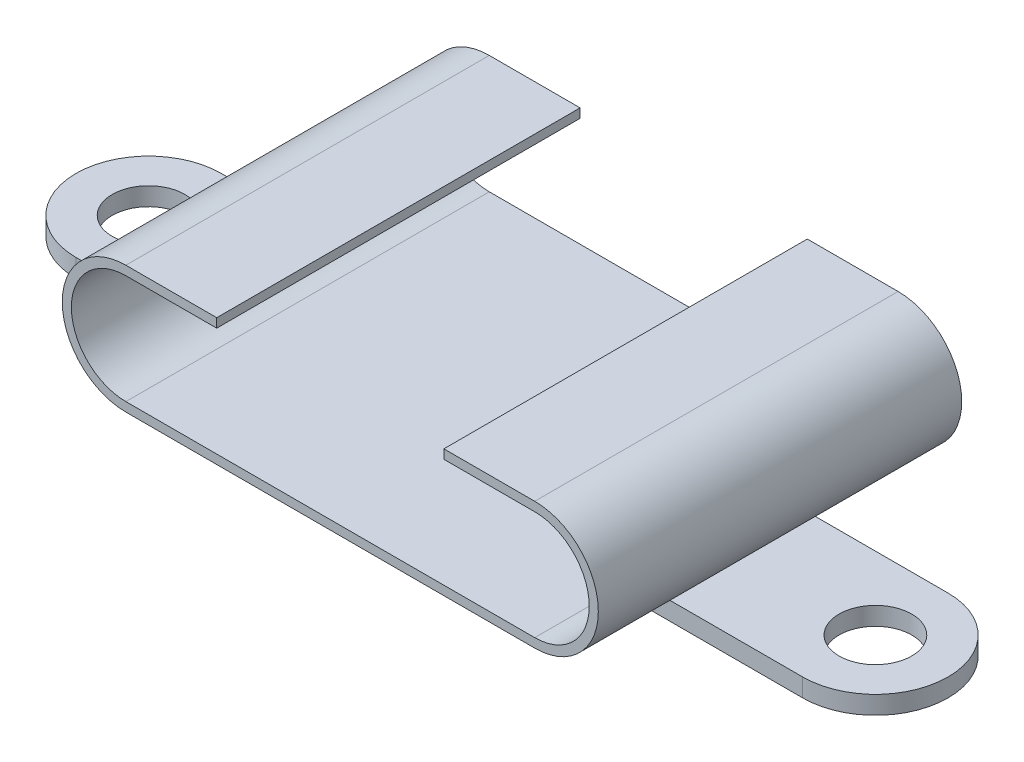
ISO-10303-21;
HEADER;
FILE_DESCRIPTION(('STEP AP214'),'2;1');
FILE_NAME('part.step','',(''),(''),'','','');
FILE_SCHEMA(('AUTOMOTIVE_DESIGN { 1 0 10303 214 1 1 1 1 }'));
ENDSEC;
DATA;
#1=APPLICATION_CONTEXT('core data for automotive mechanical design processes');
#2=APPLICATION_PROTOCOL_DEFINITION('international standard','automotive_design',2000,#1);
#3=PRODUCT_CONTEXT('',#1,'mechanical');
#4=PRODUCT('Part','Part','',(#3));
#5=PRODUCT_RELATED_PRODUCT_CATEGORY('part','',(#4));
#6=PRODUCT_DEFINITION_FORMATION('','',#4);
#7=PRODUCT_DEFINITION_CONTEXT('part definition',#1,'design');
#8=PRODUCT_DEFINITION('design','',#6,#7);
#9=PRODUCT_DEFINITION_SHAPE('','',#8);
#10=(LENGTH_UNIT() NAMED_UNIT(*) SI_UNIT(.MILLI.,.METRE.));
#11=(NAMED_UNIT(*) PLANE_ANGLE_UNIT() SI_UNIT($,.RADIAN.));
#12=(NAMED_UNIT(*) SI_UNIT($,.STERADIAN.) SOLID_ANGLE_UNIT());
#13=UNCERTAINTY_MEASURE_WITH_UNIT(LENGTH_MEASURE(1.E-05),#10,'distance_accuracy_value','');
#14=(GEOMETRIC_REPRESENTATION_CONTEXT(3) GLOBAL_UNCERTAINTY_ASSIGNED_CONTEXT((#13)) GLOBAL_UNIT_ASSIGNED_CONTEXT((#10,
#11,#12)) REPRESENTATION_CONTEXT('',''));
#15=CARTESIAN_POINT('',(0.,0.,0.));
#16=DIRECTION('',(0.,0.,1.));
#17=DIRECTION('',(1.,0.,0.));
#18=AXIS2_PLACEMENT_3D('',#15,#16,#17);
#19=CARTESIAN_POINT('',(0.,-7.,40.));
#20=DIRECTION('',(0.,1.,0.));
#21=DIRECTION('',(0.,0.,1.));
#22=AXIS2_PLACEMENT_3D('',#19,#20,#21);
#23=PLANE('',#22);
#24=DIRECTION('',(-1.,0.,0.));
#25=VECTOR('',#24,1.);
#26=CARTESIAN_POINT('',(62.5,-7.,28.));
#27=LINE('',#26,#25);
#28=CARTESIAN_POINT('',(45.,-7.,28.));
#29=VERTEX_POINT('',#28);
#30=CARTESIAN_POINT('',(0.,-7.,28.));
#31=VERTEX_POINT('',#30);
#32=EDGE_CURVE('E304',#29,#31,#27,.T.);
#33=ORIENTED_EDGE('',*,*,#32,.F.);
#34=DIRECTION('',(0.,0.,-1.));
#35=VECTOR('',#34,1.);
#36=CARTESIAN_POINT('',(45.,-7.,40.));
#37=LINE('',#36,#35);
#38=CARTESIAN_POINT('',(45.,-7.,40.));
#39=VERTEX_POINT('',#38);
#40=EDGE_CURVE('E273',#39,#29,#37,.T.);
#41=ORIENTED_EDGE('',*,*,#40,.F.);
#42=DIRECTION('',(1.,0.,0.));
#43=VECTOR('',#42,1.);
#44=CARTESIAN_POINT('',(0.,-7.,40.));
#45=LINE('',#44,#43);
#46=CARTESIAN_POINT('',(0.,-7.,40.));
#47=VERTEX_POINT('',#46);
#48=EDGE_CURVE('E248',#47,#39,#45,.T.);
#49=ORIENTED_EDGE('',*,*,#48,.F.);
#50=DIRECTION('',(0.,0.,-1.));
#51=VECTOR('',#50,1.);
#52=CARTESIAN_POINT('',(0.,-7.,40.));
#53=LINE('',#52,#51);
#54=EDGE_CURVE('E11',#47,#31,#53,.T.);
#55=ORIENTED_EDGE('',*,*,#54,.T.);
#56=EDGE_LOOP('',(#33,#41,#49,#55));
#57=FACE_BOUND('',#56,.T.);
#58=ADVANCED_FACE('F33',(#57),#23,.F.);
#59=DIRECTION('',(1.,0.,0.));
#60=VECTOR('',#59,1.);
#61=CARTESIAN_POINT('',(62.5,-7.,12.));
#62=LINE('',#61,#60);
#63=CARTESIAN_POINT('',(0.,-7.,12.));
#64=VERTEX_POINT('',#63);
#65=CARTESIAN_POINT('',(45.,-7.,12.));
#66=VERTEX_POINT('',#65);
#67=EDGE_CURVE('E48',#64,#66,#62,.T.);
#68=ORIENTED_EDGE('',*,*,#67,.F.);
#69=CARTESIAN_POINT('',(0.,-7.,0.));
#70=VERTEX_POINT('',#69);
#71=EDGE_CURVE('E41',#64,#70,#53,.T.);
#72=ORIENTED_EDGE('',*,*,#71,.T.);
#73=DIRECTION('',(1.,0.,0.));
#74=VECTOR('',#73,1.);
#75=CARTESIAN_POINT('',(0.,-7.,0.));
#76=LINE('',#75,#74);
#77=CARTESIAN_POINT('',(45.,-7.,0.));
#78=VERTEX_POINT('',#77);
#79=EDGE_CURVE('E260',#70,#78,#76,.T.);
#80=ORIENTED_EDGE('',*,*,#79,.T.);
#81=EDGE_CURVE('E272',#66,#78,#37,.T.);
#82=ORIENTED_EDGE('',*,*,#81,.F.);
#83=EDGE_LOOP('',(#68,#72,#80,#82));
#84=FACE_BOUND('',#83,.T.);
#85=ADVANCED_FACE('F286',(#84),#23,.F.);
#86=CARTESIAN_POINT('',(0.,7.,40.));
#87=DIRECTION('',(0.,-1.,0.));
#88=DIRECTION('',(0.,0.,-1.));
#89=AXIS2_PLACEMENT_3D('',#86,#87,#88);
#90=PLANE('',#89);
#91=DIRECTION('',(-1.,0.,0.));
#92=VECTOR('',#91,1.);
#93=CARTESIAN_POINT('',(0.,7.,0.));
#94=LINE('',#93,#92);
#95=CARTESIAN_POINT('',(45.,7.,0.));
#96=VERTEX_POINT('',#95);
#97=CARTESIAN_POINT('',(35.0018715987824,7.,0.));
#98=VERTEX_POINT('',#97);
#99=EDGE_CURVE('E249',#96,#98,#94,.T.);
#100=ORIENTED_EDGE('',*,*,#99,.T.);
#101=DIRECTION('',(0.,0.,-1.));
#102=VECTOR('',#101,1.);
#103=CARTESIAN_POINT('',(35.0018715987824,7.,0.));
#104=LINE('',#103,#102);
#105=CARTESIAN_POINT('',(35.0018715987824,7.,40.));
#106=VERTEX_POINT('',#105);
#107=EDGE_CURVE('E198',#106,#98,#104,.T.);
#108=ORIENTED_EDGE('',*,*,#107,.F.);
#109=DIRECTION('',(-1.,0.,0.));
#110=VECTOR('',#109,1.);
#111=CARTESIAN_POINT('',(0.,7.,40.));
#112=LINE('',#111,#110);
#113=CARTESIAN_POINT('',(45.,7.,40.));
#114=VERTEX_POINT('',#113);
#115=EDGE_CURVE('E254',#114,#106,#112,.T.);
#116=ORIENTED_EDGE('',*,*,#115,.F.);
#117=DIRECTION('',(0.,0.,-1.));
#118=VECTOR('',#117,1.);
#119=CARTESIAN_POINT('',(45.,7.,40.));
#120=LINE('',#119,#118);
#121=EDGE_CURVE('E270',#114,#96,#120,.T.);
#122=ORIENTED_EDGE('',*,*,#121,.T.);
#123=EDGE_LOOP('',(#100,#108,#116,#122));
#124=FACE_BOUND('',#123,.T.);
#125=ADVANCED_FACE('F294',(#124),#90,.F.);
#126=CARTESIAN_POINT('',(45.,6.,0.));
#127=DIRECTION('',(0.,1.,0.));
#128=DIRECTION('',(0.,0.,1.));
#129=AXIS2_PLACEMENT_3D('',#126,#127,#128);
#130=PLANE('',#129);
#131=DIRECTION('',(-1.,0.,0.));
#132=VECTOR('',#131,1.);
#133=CARTESIAN_POINT('',(45.,6.,40.));
#134=LINE('',#133,#132);
#135=CARTESIAN_POINT('',(45.,6.,40.));
#136=VERTEX_POINT('',#135);
#137=CARTESIAN_POINT('',(35.0018715987824,6.,40.));
#138=VERTEX_POINT('',#137);
#139=EDGE_CURVE('E214',#136,#138,#134,.T.);
#140=ORIENTED_EDGE('',*,*,#139,.T.);
#141=DIRECTION('',(0.,0.,1.));
#142=VECTOR('',#141,1.);
#143=CARTESIAN_POINT('',(35.0018715987824,6.,0.));
#144=LINE('',#143,#142);
#145=CARTESIAN_POINT('',(35.0018715987824,6.,0.));
#146=VERTEX_POINT('',#145);
#147=EDGE_CURVE('E194',#146,#138,#144,.T.);
#148=ORIENTED_EDGE('',*,*,#147,.F.);
#149=DIRECTION('',(-1.,0.,0.));
#150=VECTOR('',#149,1.);
#151=CARTESIAN_POINT('',(45.,6.,0.));
#152=LINE('',#151,#150);
#153=CARTESIAN_POINT('',(45.,6.,0.));
#154=VERTEX_POINT('',#153);
#155=EDGE_CURVE('E221',#154,#146,#152,.T.);
#156=ORIENTED_EDGE('',*,*,#155,.F.);
#157=DIRECTION('',(0.,0.,1.));
#158=VECTOR('',#157,1.);
#159=CARTESIAN_POINT('',(45.,6.,0.));
#160=LINE('',#159,#158);
#161=EDGE_CURVE('E239',#154,#136,#160,.T.);
#162=ORIENTED_EDGE('',*,*,#161,.T.);
#163=EDGE_LOOP('',(#140,#148,#156,#162));
#164=FACE_BOUND('',#163,.T.);
#165=ADVANCED_FACE('F356',(#164),#130,.F.);
#166=CARTESIAN_POINT('',(0.,0.,40.));
#167=DIRECTION('',(0.,0.,-1.));
#168=DIRECTION('',(-1.,0.,0.));
#169=AXIS2_PLACEMENT_3D('',#166,#167,#168);
#170=CYLINDRICAL_SURFACE('',#169,7.);
#171=CARTESIAN_POINT('',(0.,0.,0.));
#172=DIRECTION('',(0.,0.,1.));
#173=DIRECTION('',(1.,0.,0.));
#174=AXIS2_PLACEMENT_3D('',#171,#172,#173);
#175=CIRCLE('',#174,7.);
#176=CARTESIAN_POINT('',(0.,7.,0.));
#177=VERTEX_POINT('',#176);
#178=EDGE_CURVE('E238',#177,#70,#175,.T.);
#179=ORIENTED_EDGE('',*,*,#178,.T.);
#180=ORIENTED_EDGE('',*,*,#71,.F.);
#181=DIRECTION('',(0.,0.,-1.));
#182=VECTOR('',#181,1.);
#183=CARTESIAN_POINT('',(0.,-7.,40.));
#184=LINE('',#183,#182);
#185=EDGE_CURVE('E186',#31,#64,#184,.T.);
#186=ORIENTED_EDGE('',*,*,#185,.F.);
#187=ORIENTED_EDGE('',*,*,#54,.F.);
#188=CARTESIAN_POINT('',(0.,0.,40.));
#189=DIRECTION('',(0.,0.,1.));
#190=DIRECTION('',(1.,0.,0.));
#191=AXIS2_PLACEMENT_3D('',#188,#189,#190);
#192=CIRCLE('',#191,7.);
#193=CARTESIAN_POINT('',(0.,7.,40.));
#194=VERTEX_POINT('',#193);
#195=EDGE_CURVE('E245',#194,#47,#192,.T.);
#196=ORIENTED_EDGE('',*,*,#195,.F.);
#197=DIRECTION('',(0.,0.,-1.));
#198=VECTOR('',#197,1.);
#199=CARTESIAN_POINT('',(0.,7.,40.));
#200=LINE('',#199,#198);
#201=EDGE_CURVE('E257',#194,#177,#200,.T.);
#202=ORIENTED_EDGE('',*,*,#201,.T.);
#203=EDGE_LOOP('',(#179,#180,#186,#187,#196,#202));
#204=FACE_BOUND('',#203,.T.);
#205=ADVANCED_FACE('F35',(#204),#170,.T.);
#206=CARTESIAN_POINT('',(45.,0.,40.));
#207=DIRECTION('',(0.,0.,-1.));
#208=DIRECTION('',(-1.,0.,0.));
#209=AXIS2_PLACEMENT_3D('',#206,#207,#208);
#210=CYLINDRICAL_SURFACE('',#209,7.);
#211=CARTESIAN_POINT('',(45.,0.,0.));
#212=DIRECTION('',(0.,0.,1.));
#213=DIRECTION('',(1.,0.,0.));
#214=AXIS2_PLACEMENT_3D('',#211,#212,#213);
#215=CIRCLE('',#214,7.);
#216=EDGE_CURVE('E263',#78,#96,#215,.T.);
#217=ORIENTED_EDGE('',*,*,#216,.T.);
#218=ORIENTED_EDGE('',*,*,#121,.F.);
#219=CARTESIAN_POINT('',(45.,0.,40.));
#220=DIRECTION('',(0.,0.,1.));
#221=DIRECTION('',(1.,0.,0.));
#222=AXIS2_PLACEMENT_3D('',#219,#220,#221);
#223=CIRCLE('',#222,7.);
#224=EDGE_CURVE('E251',#39,#114,#223,.T.);
#225=ORIENTED_EDGE('',*,*,#224,.F.);
#226=ORIENTED_EDGE('',*,*,#40,.T.);
#227=EDGE_CURVE('E275',#29,#66,#37,.T.);
#228=ORIENTED_EDGE('',*,*,#227,.T.);
#229=ORIENTED_EDGE('',*,*,#81,.T.);
#230=EDGE_LOOP('',(#217,#218,#225,#226,#228,#229));
#231=FACE_BOUND('',#230,.T.);
#232=ADVANCED_FACE('F281',(#231),#210,.T.);
#233=CARTESIAN_POINT('',(9.99812840121763,7.,40.));
#234=VERTEX_POINT('',#233);
#235=EDGE_CURVE('E253',#234,#194,#112,.T.);
#236=ORIENTED_EDGE('',*,*,#235,.F.);
#237=DIRECTION('',(0.,0.,1.));
#238=VECTOR('',#237,1.);
#239=CARTESIAN_POINT('',(9.99812840121763,7.,0.));
#240=LINE('',#239,#238);
#241=CARTESIAN_POINT('',(9.99812840121763,7.,0.));
#242=VERTEX_POINT('',#241);
#243=EDGE_CURVE('E188',#242,#234,#240,.T.);
#244=ORIENTED_EDGE('',*,*,#243,.F.);
#245=EDGE_CURVE('E265',#242,#177,#94,.T.);
#246=ORIENTED_EDGE('',*,*,#245,.T.);
#247=ORIENTED_EDGE('',*,*,#201,.F.);
#248=EDGE_LOOP('',(#236,#244,#246,#247));
#249=FACE_BOUND('',#248,.T.);
#250=ADVANCED_FACE('F333',(#249),#90,.F.);
#251=CARTESIAN_POINT('',(0.,0.,40.));
#252=DIRECTION('',(0.,0.,1.));
#253=DIRECTION('',(1.,0.,0.));
#254=AXIS2_PLACEMENT_3D('',#251,#252,#253);
#255=PLANE('',#254);
#256=DIRECTION('',(0.,1.,0.));
#257=VECTOR('',#256,1.);
#258=CARTESIAN_POINT('',(35.0018715987824,-41.1718896578223,40.));
#259=LINE('',#258,#257);
#260=EDGE_CURVE('E202',#138,#106,#259,.T.);
#261=ORIENTED_EDGE('',*,*,#260,.F.);
#262=ORIENTED_EDGE('',*,*,#139,.F.);
#263=CARTESIAN_POINT('',(45.,0.,40.));
#264=DIRECTION('',(0.,0.,1.));
#265=DIRECTION('',(1.,0.,0.));
#266=AXIS2_PLACEMENT_3D('',#263,#264,#265);
#267=CIRCLE('',#266,6.);
#268=CARTESIAN_POINT('',(45.,-6.,40.));
#269=VERTEX_POINT('',#268);
#270=EDGE_CURVE('E229',#269,#136,#267,.T.);
#271=ORIENTED_EDGE('',*,*,#270,.F.);
#272=DIRECTION('',(1.,0.,0.));
#273=VECTOR('',#272,1.);
#274=CARTESIAN_POINT('',(0.,-6.,40.));
#275=LINE('',#274,#273);
#276=CARTESIAN_POINT('',(0.,-6.,40.));
#277=VERTEX_POINT('',#276);
#278=EDGE_CURVE('E226',#277,#269,#275,.T.);
#279=ORIENTED_EDGE('',*,*,#278,.F.);
#280=CARTESIAN_POINT('',(0.,0.,40.));
#281=DIRECTION('',(0.,0.,1.));
#282=DIRECTION('',(1.,0.,0.));
#283=AXIS2_PLACEMENT_3D('',#280,#281,#282);
#284=CIRCLE('',#283,6.);
#285=CARTESIAN_POINT('',(0.,6.,40.));
#286=VERTEX_POINT('',#285);
#287=EDGE_CURVE('E209',#286,#277,#284,.T.);
#288=ORIENTED_EDGE('',*,*,#287,.F.);
#289=CARTESIAN_POINT('',(9.99812840121765,6.,40.));
#290=VERTEX_POINT('',#289);
#291=EDGE_CURVE('E232',#290,#286,#134,.T.);
#292=ORIENTED_EDGE('',*,*,#291,.F.);
#293=DIRECTION('',(0.,1.,0.));
#294=VECTOR('',#293,1.);
#295=CARTESIAN_POINT('',(9.99812840121763,-41.1718896578223,40.));
#296=LINE('',#295,#294);
#297=EDGE_CURVE('E204',#290,#234,#296,.T.);
#298=ORIENTED_EDGE('',*,*,#297,.T.);
#299=ORIENTED_EDGE('',*,*,#235,.T.);
#300=ORIENTED_EDGE('',*,*,#195,.T.);
#301=ORIENTED_EDGE('',*,*,#48,.T.);
#302=ORIENTED_EDGE('',*,*,#224,.T.);
#303=ORIENTED_EDGE('',*,*,#115,.T.);
#304=EDGE_LOOP('',(#261,#262,#271,#279,#288,#292,#298,#299,#300,#301,#302,#303));
#305=FACE_BOUND('',#304,.T.);
#306=ADVANCED_FACE('F298',(#305),#255,.T.);
#307=CARTESIAN_POINT('',(0.,0.,0.));
#308=DIRECTION('',(0.,0.,1.));
#309=DIRECTION('',(1.,0.,0.));
#310=AXIS2_PLACEMENT_3D('',#307,#308,#309);
#311=PLANE('',#310);
#312=ORIENTED_EDGE('',*,*,#155,.T.);
#313=DIRECTION('',(0.,1.,0.));
#314=VECTOR('',#313,1.);
#315=CARTESIAN_POINT('',(35.0018715987824,-41.1718896578223,0.));
#316=LINE('',#315,#314);
#317=EDGE_CURVE('E56',#146,#98,#316,.T.);
#318=ORIENTED_EDGE('',*,*,#317,.T.);
#319=ORIENTED_EDGE('',*,*,#99,.F.);
#320=ORIENTED_EDGE('',*,*,#216,.F.);
#321=ORIENTED_EDGE('',*,*,#79,.F.);
#322=ORIENTED_EDGE('',*,*,#178,.F.);
#323=ORIENTED_EDGE('',*,*,#245,.F.);
#324=DIRECTION('',(0.,1.,0.));
#325=VECTOR('',#324,1.);
#326=CARTESIAN_POINT('',(9.99812840121763,-41.1718896578223,0.));
#327=LINE('',#326,#325);
#328=CARTESIAN_POINT('',(9.99812840121763,6.,0.));
#329=VERTEX_POINT('',#328);
#330=EDGE_CURVE('E200',#329,#242,#327,.T.);
#331=ORIENTED_EDGE('',*,*,#330,.F.);
#332=CARTESIAN_POINT('',(0.,6.,0.));
#333=VERTEX_POINT('',#332);
#334=EDGE_CURVE('E220',#329,#333,#152,.T.);
#335=ORIENTED_EDGE('',*,*,#334,.T.);
#336=CARTESIAN_POINT('',(0.,0.,0.));
#337=DIRECTION('',(0.,0.,1.));
#338=DIRECTION('',(1.,0.,0.));
#339=AXIS2_PLACEMENT_3D('',#336,#337,#338);
#340=CIRCLE('',#339,6.);
#341=CARTESIAN_POINT('',(0.,-6.,0.));
#342=VERTEX_POINT('',#341);
#343=EDGE_CURVE('E210',#333,#342,#340,.T.);
#344=ORIENTED_EDGE('',*,*,#343,.T.);
#345=DIRECTION('',(1.,0.,0.));
#346=VECTOR('',#345,1.);
#347=CARTESIAN_POINT('',(0.,-6.,0.));
#348=LINE('',#347,#346);
#349=CARTESIAN_POINT('',(45.,-6.,0.));
#350=VERTEX_POINT('',#349);
#351=EDGE_CURVE('E213',#342,#350,#348,.T.);
#352=ORIENTED_EDGE('',*,*,#351,.T.);
#353=CARTESIAN_POINT('',(45.,0.,0.));
#354=DIRECTION('',(0.,0.,1.));
#355=DIRECTION('',(1.,0.,0.));
#356=AXIS2_PLACEMENT_3D('',#353,#354,#355);
#357=CIRCLE('',#356,6.);
#358=EDGE_CURVE('E217',#350,#154,#357,.T.);
#359=ORIENTED_EDGE('',*,*,#358,.T.);
#360=EDGE_LOOP('',(#312,#318,#319,#320,#321,#322,#323,#331,#335,#344,#352,#359));
#361=FACE_BOUND('',#360,.T.);
#362=ADVANCED_FACE('F291',(#361),#311,.F.);
#363=CARTESIAN_POINT('',(0.,0.,0.));
#364=DIRECTION('',(0.,0.,1.));
#365=DIRECTION('',(1.,0.,0.));
#366=AXIS2_PLACEMENT_3D('',#363,#364,#365);
#367=CYLINDRICAL_SURFACE('',#366,6.);
#368=ORIENTED_EDGE('',*,*,#287,.T.);
#369=DIRECTION('',(0.,0.,1.));
#370=VECTOR('',#369,1.);
#371=CARTESIAN_POINT('',(0.,-6.,0.));
#372=LINE('',#371,#370);
#373=EDGE_CURVE('E224',#342,#277,#372,.T.);
#374=ORIENTED_EDGE('',*,*,#373,.F.);
#375=ORIENTED_EDGE('',*,*,#343,.F.);
#376=DIRECTION('',(0.,0.,1.));
#377=VECTOR('',#376,1.);
#378=CARTESIAN_POINT('',(0.,6.,0.));
#379=LINE('',#378,#377);
#380=EDGE_CURVE('E235',#333,#286,#379,.T.);
#381=ORIENTED_EDGE('',*,*,#380,.T.);
#382=EDGE_LOOP('',(#368,#374,#375,#381));
#383=FACE_BOUND('',#382,.T.);
#384=ADVANCED_FACE('F345',(#383),#367,.F.);
#385=ORIENTED_EDGE('',*,*,#334,.F.);
#386=DIRECTION('',(0.,0.,-1.));
#387=VECTOR('',#386,1.);
#388=CARTESIAN_POINT('',(9.99812840121763,6.,0.));
#389=LINE('',#388,#387);
#390=EDGE_CURVE('E196',#290,#329,#389,.T.);
#391=ORIENTED_EDGE('',*,*,#390,.F.);
#392=ORIENTED_EDGE('',*,*,#291,.T.);
#393=ORIENTED_EDGE('',*,*,#380,.F.);
#394=EDGE_LOOP('',(#385,#391,#392,#393));
#395=FACE_BOUND('',#394,.T.);
#396=ADVANCED_FACE('F342',(#395),#130,.F.);
#397=CARTESIAN_POINT('',(45.,0.,0.));
#398=DIRECTION('',(0.,0.,1.));
#399=DIRECTION('',(1.,0.,0.));
#400=AXIS2_PLACEMENT_3D('',#397,#398,#399);
#401=CYLINDRICAL_SURFACE('',#400,6.);
#402=ORIENTED_EDGE('',*,*,#270,.T.);
#403=ORIENTED_EDGE('',*,*,#161,.F.);
#404=ORIENTED_EDGE('',*,*,#358,.F.);
#405=DIRECTION('',(0.,0.,1.));
#406=VECTOR('',#405,1.);
#407=CARTESIAN_POINT('',(45.,-6.,0.));
#408=LINE('',#407,#406);
#409=EDGE_CURVE('E241',#350,#269,#408,.T.);
#410=ORIENTED_EDGE('',*,*,#409,.T.);
#411=EDGE_LOOP('',(#402,#403,#404,#410));
#412=FACE_BOUND('',#411,.T.);
#413=ADVANCED_FACE('F352',(#412),#401,.F.);
#414=CARTESIAN_POINT('',(0.,-6.,0.));
#415=DIRECTION('',(0.,-1.,0.));
#416=DIRECTION('',(0.,0.,-1.));
#417=AXIS2_PLACEMENT_3D('',#414,#415,#416);
#418=PLANE('',#417);
#419=ORIENTED_EDGE('',*,*,#278,.T.);
#420=ORIENTED_EDGE('',*,*,#409,.F.);
#421=ORIENTED_EDGE('',*,*,#351,.F.);
#422=ORIENTED_EDGE('',*,*,#373,.T.);
#423=EDGE_LOOP('',(#419,#420,#421,#422));
#424=FACE_BOUND('',#423,.T.);
#425=ADVANCED_FACE('F349',(#424),#418,.F.);
#426=CARTESIAN_POINT('',(9.99812840121763,-41.1718896578223,0.));
#427=DIRECTION('',(-1.,0.,0.));
#428=DIRECTION('',(0.,0.,1.));
#429=AXIS2_PLACEMENT_3D('',#426,#427,#428);
#430=PLANE('',#429);
#431=ORIENTED_EDGE('',*,*,#390,.T.);
#432=ORIENTED_EDGE('',*,*,#330,.T.);
#433=ORIENTED_EDGE('',*,*,#243,.T.);
#434=ORIENTED_EDGE('',*,*,#297,.F.);
#435=EDGE_LOOP('',(#431,#432,#433,#434));
#436=FACE_BOUND('',#435,.T.);
#437=ADVANCED_FACE('F335',(#436),#430,.F.);
#438=CARTESIAN_POINT('',(35.0018715987824,-41.1718896578223,0.));
#439=DIRECTION('',(1.,0.,0.));
#440=DIRECTION('',(0.,0.,-1.));
#441=AXIS2_PLACEMENT_3D('',#438,#439,#440);
#442=PLANE('',#441);
#443=ORIENTED_EDGE('',*,*,#147,.T.);
#444=ORIENTED_EDGE('',*,*,#260,.T.);
#445=ORIENTED_EDGE('',*,*,#107,.T.);
#446=ORIENTED_EDGE('',*,*,#317,.F.);
#447=EDGE_LOOP('',(#443,#444,#445,#446));
#448=FACE_BOUND('',#447,.T.);
#449=ADVANCED_FACE('F357',(#448),#442,.F.);
#450=CARTESIAN_POINT('',(62.5,-7.,20.));
#451=DIRECTION('',(0.,-1.,0.));
#452=DIRECTION('',(0.,0.,-1.));
#453=AXIS2_PLACEMENT_3D('',#450,#451,#452);
#454=PLANE('',#453);
#455=CARTESIAN_POINT('',(-17.5,-7.,20.));
#456=DIRECTION('',(0.,-1.,0.));
#457=DIRECTION('',(0.,0.,-1.));
#458=AXIS2_PLACEMENT_3D('',#455,#456,#457);
#459=CIRCLE('',#458,4.);
#460=CARTESIAN_POINT('',(-17.5,-7.,16.));
#461=VERTEX_POINT('',#460);
#462=EDGE_CURVE('E507',#461,#461,#459,.T.);
#463=ORIENTED_EDGE('',*,*,#462,.T.);
#464=EDGE_LOOP('',(#463));
#465=FACE_BOUND('',#464,.T.);
#466=CARTESIAN_POINT('',(-17.5,-7.,28.));
#467=VERTEX_POINT('',#466);
#468=EDGE_CURVE('E307',#31,#467,#27,.T.);
#469=ORIENTED_EDGE('',*,*,#468,.F.);
#470=ORIENTED_EDGE('',*,*,#185,.T.);
#471=CARTESIAN_POINT('',(-17.5,-7.,12.));
#472=VERTEX_POINT('',#471);
#473=EDGE_CURVE('E181',#472,#64,#62,.T.);
#474=ORIENTED_EDGE('',*,*,#473,.F.);
#475=CARTESIAN_POINT('',(-17.5,-7.,20.));
#476=DIRECTION('',(0.,-1.,0.));
#477=DIRECTION('',(0.,0.,-1.));
#478=AXIS2_PLACEMENT_3D('',#475,#476,#477);
#479=CIRCLE('',#478,7.99999999999999);
#480=EDGE_CURVE('E309',#467,#472,#479,.T.);
#481=ORIENTED_EDGE('',*,*,#480,.F.);
#482=EDGE_LOOP('',(#469,#470,#474,#481));
#483=FACE_BOUND('',#482,.T.);
#484=ADVANCED_FACE('F324',(#465,#483),#454,.F.);
#485=CARTESIAN_POINT('',(62.5,-9.,20.));
#486=DIRECTION('',(0.,-1.,0.));
#487=DIRECTION('',(0.,0.,-1.));
#488=AXIS2_PLACEMENT_3D('',#485,#486,#487);
#489=PLANE('',#488);
#490=CARTESIAN_POINT('',(-17.5,-9.,20.));
#491=DIRECTION('',(0.,-1.,0.));
#492=DIRECTION('',(0.,0.,-1.));
#493=AXIS2_PLACEMENT_3D('',#490,#491,#492);
#494=CIRCLE('',#493,4.);
#495=CARTESIAN_POINT('',(-17.5,-9.,16.));
#496=VERTEX_POINT('',#495);
#497=EDGE_CURVE('E510',#496,#496,#494,.T.);
#498=ORIENTED_EDGE('',*,*,#497,.F.);
#499=EDGE_LOOP('',(#498));
#500=FACE_BOUND('',#499,.T.);
#501=CARTESIAN_POINT('',(62.5,-9.,20.));
#502=DIRECTION('',(0.,-1.,0.));
#503=DIRECTION('',(0.,0.,-1.));
#504=AXIS2_PLACEMENT_3D('',#501,#502,#503);
#505=CIRCLE('',#504,7.99999999999999);
#506=CARTESIAN_POINT('',(62.5,-9.,12.));
#507=VERTEX_POINT('',#506);
#508=CARTESIAN_POINT('',(62.5,-9.,28.));
#509=VERTEX_POINT('',#508);
#510=EDGE_CURVE('E171',#507,#509,#505,.T.);
#511=ORIENTED_EDGE('',*,*,#510,.T.);
#512=DIRECTION('',(-1.,0.,0.));
#513=VECTOR('',#512,1.);
#514=CARTESIAN_POINT('',(62.5,-9.,28.));
#515=LINE('',#514,#513);
#516=CARTESIAN_POINT('',(-17.5,-9.,28.));
#517=VERTEX_POINT('',#516);
#518=EDGE_CURVE('E159',#509,#517,#515,.T.);
#519=ORIENTED_EDGE('',*,*,#518,.T.);
#520=CARTESIAN_POINT('',(-17.5,-9.,20.));
#521=DIRECTION('',(0.,-1.,0.));
#522=DIRECTION('',(0.,0.,-1.));
#523=AXIS2_PLACEMENT_3D('',#520,#521,#522);
#524=CIRCLE('',#523,7.99999999999999);
#525=CARTESIAN_POINT('',(-17.5,-9.,12.));
#526=VERTEX_POINT('',#525);
#527=EDGE_CURVE('E170',#517,#526,#524,.T.);
#528=ORIENTED_EDGE('',*,*,#527,.T.);
#529=DIRECTION('',(1.,0.,0.));
#530=VECTOR('',#529,1.);
#531=CARTESIAN_POINT('',(62.5,-9.,12.));
#532=LINE('',#531,#530);
#533=EDGE_CURVE('E177',#526,#507,#532,.T.);
#534=ORIENTED_EDGE('',*,*,#533,.T.);
#535=EDGE_LOOP('',(#511,#519,#528,#534));
#536=FACE_BOUND('',#535,.T.);
#537=CARTESIAN_POINT('',(62.5,-9.,20.));
#538=DIRECTION('',(0.,-1.,0.));
#539=DIRECTION('',(0.,0.,1.));
#540=AXIS2_PLACEMENT_3D('',#537,#538,#539);
#541=CIRCLE('',#540,3.99999999999999);
#542=CARTESIAN_POINT('',(62.5,-9.,24.));
#543=VERTEX_POINT('',#542);
#544=EDGE_CURVE('E501',#543,#543,#541,.T.);
#545=ORIENTED_EDGE('',*,*,#544,.F.);
#546=EDGE_LOOP('',(#545));
#547=FACE_BOUND('',#546,.T.);
#548=ADVANCED_FACE('F174',(#500,#536,#547),#489,.T.);
#549=ORIENTED_EDGE('',*,*,#227,.F.);
#550=CARTESIAN_POINT('',(62.5,-7.,28.));
#551=VERTEX_POINT('',#550);
#552=EDGE_CURVE('E306',#551,#29,#27,.T.);
#553=ORIENTED_EDGE('',*,*,#552,.F.);
#554=CARTESIAN_POINT('',(62.5,-7.,20.));
#555=DIRECTION('',(0.,-1.,0.));
#556=DIRECTION('',(0.,0.,-1.));
#557=AXIS2_PLACEMENT_3D('',#554,#555,#556);
#558=CIRCLE('',#557,7.99999999999999);
#559=CARTESIAN_POINT('',(62.5,-7.,12.));
#560=VERTEX_POINT('',#559);
#561=EDGE_CURVE('E185',#560,#551,#558,.T.);
#562=ORIENTED_EDGE('',*,*,#561,.F.);
#563=EDGE_CURVE('E314',#66,#560,#62,.T.);
#564=ORIENTED_EDGE('',*,*,#563,.F.);
#565=EDGE_LOOP('',(#549,#553,#562,#564));
#566=FACE_BOUND('',#565,.T.);
#567=CARTESIAN_POINT('',(62.5,-7.,20.));
#568=DIRECTION('',(0.,-1.,0.));
#569=DIRECTION('',(0.,0.,1.));
#570=AXIS2_PLACEMENT_3D('',#567,#568,#569);
#571=CIRCLE('',#570,3.99999999999999);
#572=CARTESIAN_POINT('',(62.5,-7.,24.));
#573=VERTEX_POINT('',#572);
#574=EDGE_CURVE('E504',#573,#573,#571,.T.);
#575=ORIENTED_EDGE('',*,*,#574,.T.);
#576=EDGE_LOOP('',(#575));
#577=FACE_BOUND('',#576,.T.);
#578=ADVANCED_FACE('F366',(#566,#577),#454,.F.);
#579=CARTESIAN_POINT('',(62.5,-9.,20.));
#580=DIRECTION('',(0.,1.,0.));
#581=DIRECTION('',(0.,0.,1.));
#582=AXIS2_PLACEMENT_3D('',#579,#580,#581);
#583=CYLINDRICAL_SURFACE('',#582,7.99999999999999);
#584=ORIENTED_EDGE('',*,*,#561,.T.);
#585=DIRECTION('',(0.,1.,0.));
#586=VECTOR('',#585,1.);
#587=CARTESIAN_POINT('',(62.5,-9.,28.));
#588=LINE('',#587,#586);
#589=EDGE_CURVE('E164',#509,#551,#588,.T.);
#590=ORIENTED_EDGE('',*,*,#589,.F.);
#591=ORIENTED_EDGE('',*,*,#510,.F.);
#592=DIRECTION('',(0.,1.,0.));
#593=VECTOR('',#592,1.);
#594=CARTESIAN_POINT('',(62.5,-9.,12.));
#595=LINE('',#594,#593);
#596=EDGE_CURVE('E316',#507,#560,#595,.T.);
#597=ORIENTED_EDGE('',*,*,#596,.T.);
#598=EDGE_LOOP('',(#584,#590,#591,#597));
#599=FACE_BOUND('',#598,.T.);
#600=ADVANCED_FACE('F183',(#599),#583,.T.);
#601=CARTESIAN_POINT('',(62.5,-9.,28.));
#602=DIRECTION('',(0.,0.,-1.));
#603=DIRECTION('',(-1.,0.,0.));
#604=AXIS2_PLACEMENT_3D('',#601,#602,#603);
#605=PLANE('',#604);
#606=ORIENTED_EDGE('',*,*,#552,.T.);
#607=ORIENTED_EDGE('',*,*,#32,.T.);
#608=ORIENTED_EDGE('',*,*,#468,.T.);
#609=DIRECTION('',(0.,1.,0.));
#610=VECTOR('',#609,1.);
#611=CARTESIAN_POINT('',(-17.5,-9.,28.));
#612=LINE('',#611,#610);
#613=EDGE_CURVE('E167',#517,#467,#612,.T.);
#614=ORIENTED_EDGE('',*,*,#613,.F.);
#615=ORIENTED_EDGE('',*,*,#518,.F.);
#616=ORIENTED_EDGE('',*,*,#589,.T.);
#617=EDGE_LOOP('',(#606,#607,#608,#614,#615,#616));
#618=FACE_BOUND('',#617,.T.);
#619=ADVANCED_FACE('F162',(#618),#605,.F.);
#620=CARTESIAN_POINT('',(-17.5,-9.,20.));
#621=DIRECTION('',(0.,1.,0.));
#622=DIRECTION('',(0.,0.,1.));
#623=AXIS2_PLACEMENT_3D('',#620,#621,#622);
#624=CYLINDRICAL_SURFACE('',#623,7.99999999999999);
#625=ORIENTED_EDGE('',*,*,#480,.T.);
#626=DIRECTION('',(0.,1.,0.));
#627=VECTOR('',#626,1.);
#628=CARTESIAN_POINT('',(-17.5,-9.,12.));
#629=LINE('',#628,#627);
#630=EDGE_CURVE('E190',#526,#472,#629,.T.);
#631=ORIENTED_EDGE('',*,*,#630,.F.);
#632=ORIENTED_EDGE('',*,*,#527,.F.);
#633=ORIENTED_EDGE('',*,*,#613,.T.);
#634=EDGE_LOOP('',(#625,#631,#632,#633));
#635=FACE_BOUND('',#634,.T.);
#636=ADVANCED_FACE('F458',(#635),#624,.T.);
#637=CARTESIAN_POINT('',(62.5,-9.,12.));
#638=DIRECTION('',(0.,0.,1.));
#639=DIRECTION('',(1.,0.,0.));
#640=AXIS2_PLACEMENT_3D('',#637,#638,#639);
#641=PLANE('',#640);
#642=ORIENTED_EDGE('',*,*,#473,.T.);
#643=ORIENTED_EDGE('',*,*,#67,.T.);
#644=ORIENTED_EDGE('',*,*,#563,.T.);
#645=ORIENTED_EDGE('',*,*,#596,.F.);
#646=ORIENTED_EDGE('',*,*,#533,.F.);
#647=ORIENTED_EDGE('',*,*,#630,.T.);
#648=EDGE_LOOP('',(#642,#643,#644,#645,#646,#647));
#649=FACE_BOUND('',#648,.T.);
#650=ADVANCED_FACE('F320',(#649),#641,.F.);
#651=CARTESIAN_POINT('',(-17.5,-9.,20.));
#652=DIRECTION('',(0.,1.,0.));
#653=DIRECTION('',(0.,0.,1.));
#654=AXIS2_PLACEMENT_3D('',#651,#652,#653);
#655=CYLINDRICAL_SURFACE('',#654,4.);
#656=ORIENTED_EDGE('',*,*,#497,.T.);
#657=EDGE_LOOP('',(#656));
#658=FACE_BOUND('',#657,.T.);
#659=ORIENTED_EDGE('',*,*,#462,.F.);
#660=EDGE_LOOP('',(#659));
#661=FACE_BOUND('',#660,.T.);
#662=ADVANCED_FACE('F475',(#658,#661),#655,.F.);
#663=CARTESIAN_POINT('',(62.5,-9.,20.));
#664=DIRECTION('',(0.,1.,0.));
#665=DIRECTION('',(0.,0.,1.));
#666=AXIS2_PLACEMENT_3D('',#663,#664,#665);
#667=CYLINDRICAL_SURFACE('',#666,3.99999999999999);
#668=ORIENTED_EDGE('',*,*,#544,.T.);
#669=EDGE_LOOP('',(#668));
#670=FACE_BOUND('',#669,.T.);
#671=ORIENTED_EDGE('',*,*,#574,.F.);
#672=EDGE_LOOP('',(#671));
#673=FACE_BOUND('',#672,.T.);
#674=ADVANCED_FACE('F484',(#670,#673),#667,.F.);
#675=CLOSED_SHELL('',(#58,#85,#125,#165,#205,#232,#250,#306,#362,#384,#396,#413,#425,#437,#449,
#484,#548,#578,#600,#619,#636,#650,#662,#674));
#676=MANIFOLD_SOLID_BREP('B2',#675);
#677=ADVANCED_BREP_SHAPE_REPRESENTATION('',(#18,#676),#14);
#678=SHAPE_DEFINITION_REPRESENTATION(#9,#677);
ENDSEC;
END-ISO-10303-21;
